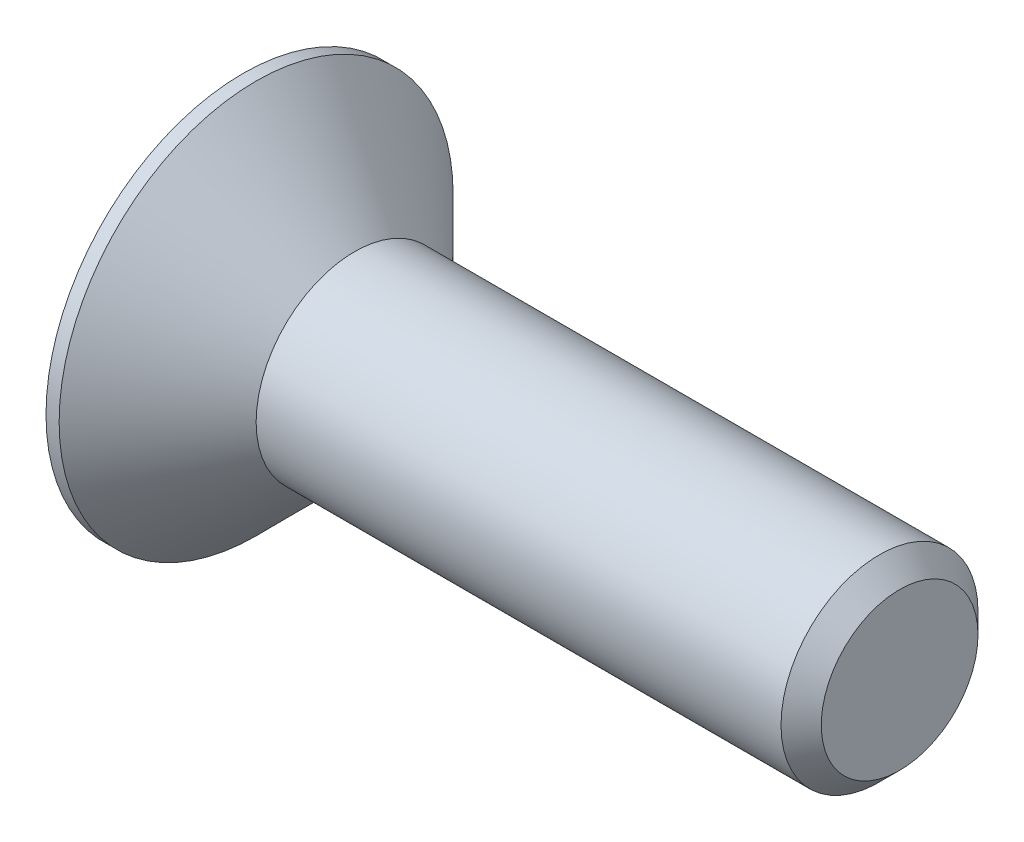
ISO-10303-21;
HEADER;
FILE_DESCRIPTION(('STEP AP214'),'2;1');
FILE_NAME('part.step','',(''),(''),'','','');
FILE_SCHEMA(('AUTOMOTIVE_DESIGN { 1 0 10303 214 1 1 1 1 }'));
ENDSEC;
DATA;
#1=APPLICATION_CONTEXT('core data for automotive mechanical design processes');
#2=APPLICATION_PROTOCOL_DEFINITION('international standard','automotive_design',2000,#1);
#3=PRODUCT_CONTEXT('',#1,'mechanical');
#4=PRODUCT('Part','Part','',(#3));
#5=PRODUCT_RELATED_PRODUCT_CATEGORY('part','',(#4));
#6=PRODUCT_DEFINITION_FORMATION('','',#4);
#7=PRODUCT_DEFINITION_CONTEXT('part definition',#1,'design');
#8=PRODUCT_DEFINITION('design','',#6,#7);
#9=PRODUCT_DEFINITION_SHAPE('','',#8);
#10=(LENGTH_UNIT() NAMED_UNIT(*) SI_UNIT(.MILLI.,.METRE.));
#11=(NAMED_UNIT(*) PLANE_ANGLE_UNIT() SI_UNIT($,.RADIAN.));
#12=(NAMED_UNIT(*) SI_UNIT($,.STERADIAN.) SOLID_ANGLE_UNIT());
#13=UNCERTAINTY_MEASURE_WITH_UNIT(LENGTH_MEASURE(1.E-05),#10,'distance_accuracy_value','');
#14=(GEOMETRIC_REPRESENTATION_CONTEXT(3) GLOBAL_UNCERTAINTY_ASSIGNED_CONTEXT((#13)) GLOBAL_UNIT_ASSIGNED_CONTEXT((#10,
#11,#12)) REPRESENTATION_CONTEXT('',''));
#15=CARTESIAN_POINT('',(0.,0.,0.));
#16=DIRECTION('',(0.,0.,1.));
#17=DIRECTION('',(1.,0.,0.));
#18=AXIS2_PLACEMENT_3D('',#15,#16,#17);
#19=CARTESIAN_POINT('',(-1.7,0.,0.));
#20=DIRECTION('',(1.,0.,0.));
#21=DIRECTION('',(0.,0.,-1.));
#22=AXIS2_PLACEMENT_3D('',#19,#20,#21);
#23=PLANE('',#22);
#24=CARTESIAN_POINT('',(-1.7,0.,0.));
#25=DIRECTION('',(1.,0.,0.));
#26=DIRECTION('',(0.,0.,-1.));
#27=AXIS2_PLACEMENT_3D('',#24,#25,#26);
#28=CIRCLE('',#27,3.);
#29=CARTESIAN_POINT('',(-1.7,0.,-3.));
#30=VERTEX_POINT('',#29);
#31=EDGE_CURVE('E11',#30,#30,#28,.T.);
#32=ORIENTED_EDGE('',*,*,#31,.F.);
#33=EDGE_LOOP('',(#32));
#34=FACE_BOUND('',#33,.T.);
#35=DIRECTION('',(0.,0.5,-0.866025403784439));
#36=VECTOR('',#35,1.);
#37=CARTESIAN_POINT('',(-1.7,-1.15470053837925,0.));
#38=LINE('',#37,#36);
#39=CARTESIAN_POINT('',(-1.7,-1.15470053837925,0.));
#40=VERTEX_POINT('',#39);
#41=CARTESIAN_POINT('',(-1.7,-0.577350269189626,-1.));
#42=VERTEX_POINT('',#41);
#43=EDGE_CURVE('E149',#40,#42,#38,.T.);
#44=ORIENTED_EDGE('',*,*,#43,.T.);
#45=DIRECTION('',(0.,1.,0.));
#46=VECTOR('',#45,1.);
#47=CARTESIAN_POINT('',(-1.7,-0.577350269189626,-1.));
#48=LINE('',#47,#46);
#49=CARTESIAN_POINT('',(-1.7,0.577350269189626,-1.));
#50=VERTEX_POINT('',#49);
#51=EDGE_CURVE('E151',#42,#50,#48,.T.);
#52=ORIENTED_EDGE('',*,*,#51,.T.);
#53=DIRECTION('',(0.,0.5,0.866025403784439));
#54=VECTOR('',#53,1.);
#55=CARTESIAN_POINT('',(-1.7,0.577350269189626,-1.));
#56=LINE('',#55,#54);
#57=CARTESIAN_POINT('',(-1.7,1.15470053837925,0.));
#58=VERTEX_POINT('',#57);
#59=EDGE_CURVE('E154',#50,#58,#56,.T.);
#60=ORIENTED_EDGE('',*,*,#59,.T.);
#61=DIRECTION('',(0.,-0.5,0.866025403784439));
#62=VECTOR('',#61,1.);
#63=CARTESIAN_POINT('',(-1.7,1.15470053837925,0.));
#64=LINE('',#63,#62);
#65=CARTESIAN_POINT('',(-1.7,0.577350269189626,1.));
#66=VERTEX_POINT('',#65);
#67=EDGE_CURVE('E99',#58,#66,#64,.T.);
#68=ORIENTED_EDGE('',*,*,#67,.T.);
#69=DIRECTION('',(0.,-1.,0.));
#70=VECTOR('',#69,1.);
#71=CARTESIAN_POINT('',(-1.7,0.577350269189626,1.));
#72=LINE('',#71,#70);
#73=CARTESIAN_POINT('',(-1.7,-0.577350269189626,1.));
#74=VERTEX_POINT('',#73);
#75=EDGE_CURVE('E156',#66,#74,#72,.T.);
#76=ORIENTED_EDGE('',*,*,#75,.T.);
#77=DIRECTION('',(0.,-0.5,-0.866025403784439));
#78=VECTOR('',#77,1.);
#79=CARTESIAN_POINT('',(-1.7,-0.577350269189626,1.));
#80=LINE('',#79,#78);
#81=EDGE_CURVE('E114',#74,#40,#80,.T.);
#82=ORIENTED_EDGE('',*,*,#81,.T.);
#83=EDGE_LOOP('',(#44,#52,#60,#68,#76,#82));
#84=FACE_BOUND('',#83,.T.);
#85=ADVANCED_FACE('F16',(#34,#84),#23,.F.);
#86=CARTESIAN_POINT('',(8.3,0.,0.));
#87=DIRECTION('',(1.,0.,0.));
#88=DIRECTION('',(0.,0.,-1.));
#89=AXIS2_PLACEMENT_3D('',#86,#87,#88);
#90=CYLINDRICAL_SURFACE('',#89,3.);
#91=CARTESIAN_POINT('',(-1.5,0.,0.));
#92=DIRECTION('',(1.,0.,0.));
#93=DIRECTION('',(0.,0.,-1.));
#94=AXIS2_PLACEMENT_3D('',#91,#92,#93);
#95=CIRCLE('',#94,3.);
#96=CARTESIAN_POINT('',(-1.5,0.,-3.));
#97=VERTEX_POINT('',#96);
#98=EDGE_CURVE('E23',#97,#97,#95,.T.);
#99=ORIENTED_EDGE('',*,*,#98,.F.);
#100=EDGE_LOOP('',(#99));
#101=FACE_BOUND('',#100,.T.);
#102=ORIENTED_EDGE('',*,*,#31,.T.);
#103=EDGE_LOOP('',(#102));
#104=FACE_BOUND('',#103,.T.);
#105=ADVANCED_FACE('F140',(#101,#104),#90,.T.);
#106=CARTESIAN_POINT('',(-1.5,0.,0.));
#107=DIRECTION('',(-1.,0.,0.));
#108=DIRECTION('',(0.,0.,1.));
#109=AXIS2_PLACEMENT_3D('',#106,#107,#108);
#110=CONICAL_SURFACE('',#109,3.,0.785398163397449);
#111=CARTESIAN_POINT('',(0.,0.,0.));
#112=DIRECTION('',(1.,0.,0.));
#113=DIRECTION('',(0.,0.,-1.));
#114=AXIS2_PLACEMENT_3D('',#111,#112,#113);
#115=CIRCLE('',#114,1.5);
#116=CARTESIAN_POINT('',(0.,0.,-1.5));
#117=VERTEX_POINT('',#116);
#118=EDGE_CURVE('E133',#117,#117,#115,.T.);
#119=ORIENTED_EDGE('',*,*,#118,.F.);
#120=EDGE_LOOP('',(#119));
#121=FACE_BOUND('',#120,.T.);
#122=ORIENTED_EDGE('',*,*,#98,.T.);
#123=EDGE_LOOP('',(#122));
#124=FACE_BOUND('',#123,.T.);
#125=ADVANCED_FACE('F138',(#121,#124),#110,.T.);
#126=CARTESIAN_POINT('',(8.3,0.,0.));
#127=DIRECTION('',(1.,0.,0.));
#128=DIRECTION('',(0.,0.,-1.));
#129=AXIS2_PLACEMENT_3D('',#126,#127,#128);
#130=CYLINDRICAL_SURFACE('',#129,1.5);
#131=CARTESIAN_POINT('',(7.9935,0.,0.));
#132=DIRECTION('',(1.,0.,0.));
#133=DIRECTION('',(0.,0.,-1.));
#134=AXIS2_PLACEMENT_3D('',#131,#132,#133);
#135=CIRCLE('',#134,1.5);
#136=CARTESIAN_POINT('',(7.9935,0.,-1.5));
#137=VERTEX_POINT('',#136);
#138=EDGE_CURVE('E130',#137,#137,#135,.T.);
#139=ORIENTED_EDGE('',*,*,#138,.F.);
#140=EDGE_LOOP('',(#139));
#141=FACE_BOUND('',#140,.T.);
#142=ORIENTED_EDGE('',*,*,#118,.T.);
#143=EDGE_LOOP('',(#142));
#144=FACE_BOUND('',#143,.T.);
#145=ADVANCED_FACE('F243',(#141,#144),#130,.T.);
#146=CARTESIAN_POINT('',(7.9935,0.,0.));
#147=DIRECTION('',(-1.,0.,0.));
#148=DIRECTION('',(0.,0.,1.));
#149=AXIS2_PLACEMENT_3D('',#146,#147,#148);
#150=CONICAL_SURFACE('',#149,1.5,0.785398163397449);
#151=CARTESIAN_POINT('',(8.3,0.,0.));
#152=DIRECTION('',(1.,0.,0.));
#153=DIRECTION('',(0.,0.,-1.));
#154=AXIS2_PLACEMENT_3D('',#151,#152,#153);
#155=CIRCLE('',#154,1.1935);
#156=CARTESIAN_POINT('',(8.3,0.,-1.1935));
#157=VERTEX_POINT('',#156);
#158=EDGE_CURVE('E126',#157,#157,#155,.T.);
#159=ORIENTED_EDGE('',*,*,#158,.F.);
#160=EDGE_LOOP('',(#159));
#161=FACE_BOUND('',#160,.T.);
#162=ORIENTED_EDGE('',*,*,#138,.T.);
#163=EDGE_LOOP('',(#162));
#164=FACE_BOUND('',#163,.T.);
#165=ADVANCED_FACE('F239',(#161,#164),#150,.T.);
#166=CARTESIAN_POINT('',(8.3,1.1935,0.));
#167=DIRECTION('',(-1.,0.,0.));
#168=DIRECTION('',(0.,0.,1.));
#169=AXIS2_PLACEMENT_3D('',#166,#167,#168);
#170=PLANE('',#169);
#171=ORIENTED_EDGE('',*,*,#158,.T.);
#172=EDGE_LOOP('',(#171));
#173=FACE_BOUND('',#172,.T.);
#174=ADVANCED_FACE('F234',(#173),#170,.F.);
#175=CARTESIAN_POINT('',(-0.85,0.577350269189626,1.));
#176=DIRECTION('',(0.,0.,-1.));
#177=DIRECTION('',(-1.,0.,0.));
#178=AXIS2_PLACEMENT_3D('',#175,#176,#177);
#179=PLANE('',#178);
#180=ORIENTED_EDGE('',*,*,#75,.F.);
#181=DIRECTION('',(-1.,0.,0.));
#182=VECTOR('',#181,1.);
#183=CARTESIAN_POINT('',(-0.85,0.577350269189626,1.));
#184=LINE('',#183,#182);
#185=CARTESIAN_POINT('',(-0.85,0.577350269189626,1.));
#186=VERTEX_POINT('',#185);
#187=EDGE_CURVE('E163',#186,#66,#184,.T.);
#188=ORIENTED_EDGE('',*,*,#187,.F.);
#189=DIRECTION('',(0.,-1.,0.));
#190=VECTOR('',#189,1.);
#191=CARTESIAN_POINT('',(-0.85,0.577350269189626,1.));
#192=LINE('',#191,#190);
#193=CARTESIAN_POINT('',(-0.85,0.,1.));
#194=VERTEX_POINT('',#193);
#195=EDGE_CURVE('E96',#186,#194,#192,.T.);
#196=ORIENTED_EDGE('',*,*,#195,.T.);
#197=CARTESIAN_POINT('',(-0.85,-0.577350269189626,1.));
#198=VERTEX_POINT('',#197);
#199=EDGE_CURVE('E88',#194,#198,#192,.T.);
#200=ORIENTED_EDGE('',*,*,#199,.T.);
#201=DIRECTION('',(-1.,0.,0.));
#202=VECTOR('',#201,1.);
#203=CARTESIAN_POINT('',(-0.85,-0.577350269189626,1.));
#204=LINE('',#203,#202);
#205=EDGE_CURVE('E92',#198,#74,#204,.T.);
#206=ORIENTED_EDGE('',*,*,#205,.T.);
#207=EDGE_LOOP('',(#180,#188,#196,#200,#206));
#208=FACE_BOUND('',#207,.T.);
#209=ADVANCED_FACE('F90',(#208),#179,.T.);
#210=CARTESIAN_POINT('',(-0.85,-0.577350269189626,1.));
#211=DIRECTION('',(0.,0.866025403784439,-0.5));
#212=DIRECTION('',(0.,0.5,0.866025403784439));
#213=AXIS2_PLACEMENT_3D('',#210,#211,#212);
#214=PLANE('',#213);
#215=ORIENTED_EDGE('',*,*,#81,.F.);
#216=ORIENTED_EDGE('',*,*,#205,.F.);
#217=DIRECTION('',(0.,-0.5,-0.866025403784439));
#218=VECTOR('',#217,1.);
#219=CARTESIAN_POINT('',(-0.85,-0.577350269189626,1.));
#220=LINE('',#219,#218);
#221=CARTESIAN_POINT('',(-0.85,-0.866025403784439,0.5));
#222=VERTEX_POINT('',#221);
#223=EDGE_CURVE('E102',#198,#222,#220,.T.);
#224=ORIENTED_EDGE('',*,*,#223,.T.);
#225=CARTESIAN_POINT('',(-0.85,-1.15470053837925,0.));
#226=VERTEX_POINT('',#225);
#227=EDGE_CURVE('E109',#222,#226,#220,.T.);
#228=ORIENTED_EDGE('',*,*,#227,.T.);
#229=DIRECTION('',(-1.,0.,0.));
#230=VECTOR('',#229,1.);
#231=CARTESIAN_POINT('',(-0.85,-1.15470053837925,0.));
#232=LINE('',#231,#230);
#233=EDGE_CURVE('E116',#226,#40,#232,.T.);
#234=ORIENTED_EDGE('',*,*,#233,.T.);
#235=EDGE_LOOP('',(#215,#216,#224,#228,#234));
#236=FACE_BOUND('',#235,.T.);
#237=ADVANCED_FACE('F111',(#236),#214,.T.);
#238=CARTESIAN_POINT('',(-0.85,-1.15470053837925,0.));
#239=DIRECTION('',(0.,0.866025403784439,0.5));
#240=DIRECTION('',(0.,-0.5,0.866025403784439));
#241=AXIS2_PLACEMENT_3D('',#238,#239,#240);
#242=PLANE('',#241);
#243=ORIENTED_EDGE('',*,*,#43,.F.);
#244=ORIENTED_EDGE('',*,*,#233,.F.);
#245=DIRECTION('',(0.,0.5,-0.866025403784439));
#246=VECTOR('',#245,1.);
#247=CARTESIAN_POINT('',(-0.85,-1.15470053837925,0.));
#248=LINE('',#247,#246);
#249=CARTESIAN_POINT('',(-0.85,-0.866025403784439,-0.5));
#250=VERTEX_POINT('',#249);
#251=EDGE_CURVE('E30',#226,#250,#248,.T.);
#252=ORIENTED_EDGE('',*,*,#251,.T.);
#253=CARTESIAN_POINT('',(-0.85,-0.577350269189626,-1.));
#254=VERTEX_POINT('',#253);
#255=EDGE_CURVE('E108',#250,#254,#248,.T.);
#256=ORIENTED_EDGE('',*,*,#255,.T.);
#257=DIRECTION('',(-1.,0.,0.));
#258=VECTOR('',#257,1.);
#259=CARTESIAN_POINT('',(-0.85,-0.577350269189626,-1.));
#260=LINE('',#259,#258);
#261=EDGE_CURVE('E122',#254,#42,#260,.T.);
#262=ORIENTED_EDGE('',*,*,#261,.T.);
#263=EDGE_LOOP('',(#243,#244,#252,#256,#262));
#264=FACE_BOUND('',#263,.T.);
#265=ADVANCED_FACE('F173',(#264),#242,.T.);
#266=CARTESIAN_POINT('',(-0.85,-0.577350269189626,-1.));
#267=DIRECTION('',(0.,0.,1.));
#268=DIRECTION('',(1.,0.,0.));
#269=AXIS2_PLACEMENT_3D('',#266,#267,#268);
#270=PLANE('',#269);
#271=ORIENTED_EDGE('',*,*,#51,.F.);
#272=ORIENTED_EDGE('',*,*,#261,.F.);
#273=DIRECTION('',(0.,1.,0.));
#274=VECTOR('',#273,1.);
#275=CARTESIAN_POINT('',(-0.85,-0.577350269189626,-1.));
#276=LINE('',#275,#274);
#277=CARTESIAN_POINT('',(-0.85,0.,-1.));
#278=VERTEX_POINT('',#277);
#279=EDGE_CURVE('E178',#254,#278,#276,.T.);
#280=ORIENTED_EDGE('',*,*,#279,.T.);
#281=CARTESIAN_POINT('',(-0.85,0.577350269189626,-1.));
#282=VERTEX_POINT('',#281);
#283=EDGE_CURVE('E186',#278,#282,#276,.T.);
#284=ORIENTED_EDGE('',*,*,#283,.T.);
#285=DIRECTION('',(-1.,0.,0.));
#286=VECTOR('',#285,1.);
#287=CARTESIAN_POINT('',(-0.85,0.577350269189626,-1.));
#288=LINE('',#287,#286);
#289=EDGE_CURVE('E170',#282,#50,#288,.T.);
#290=ORIENTED_EDGE('',*,*,#289,.T.);
#291=EDGE_LOOP('',(#271,#272,#280,#284,#290));
#292=FACE_BOUND('',#291,.T.);
#293=ADVANCED_FACE('F177',(#292),#270,.T.);
#294=CARTESIAN_POINT('',(-0.85,0.577350269189626,-1.));
#295=DIRECTION('',(0.,-0.866025403784439,0.5));
#296=DIRECTION('',(0.,-0.5,-0.866025403784439));
#297=AXIS2_PLACEMENT_3D('',#294,#295,#296);
#298=PLANE('',#297);
#299=ORIENTED_EDGE('',*,*,#59,.F.);
#300=ORIENTED_EDGE('',*,*,#289,.F.);
#301=DIRECTION('',(0.,0.5,0.866025403784439));
#302=VECTOR('',#301,1.);
#303=CARTESIAN_POINT('',(-0.85,0.577350269189626,-1.));
#304=LINE('',#303,#302);
#305=CARTESIAN_POINT('',(-0.85,0.866025403784439,-0.5));
#306=VERTEX_POINT('',#305);
#307=EDGE_CURVE('E188',#282,#306,#304,.T.);
#308=ORIENTED_EDGE('',*,*,#307,.T.);
#309=CARTESIAN_POINT('',(-0.85,1.15470053837925,0.));
#310=VERTEX_POINT('',#309);
#311=EDGE_CURVE('E185',#306,#310,#304,.T.);
#312=ORIENTED_EDGE('',*,*,#311,.T.);
#313=DIRECTION('',(-1.,0.,0.));
#314=VECTOR('',#313,1.);
#315=CARTESIAN_POINT('',(-0.85,1.15470053837925,0.));
#316=LINE('',#315,#314);
#317=EDGE_CURVE('E166',#310,#58,#316,.T.);
#318=ORIENTED_EDGE('',*,*,#317,.T.);
#319=EDGE_LOOP('',(#299,#300,#308,#312,#318));
#320=FACE_BOUND('',#319,.T.);
#321=ADVANCED_FACE('F216',(#320),#298,.T.);
#322=CARTESIAN_POINT('',(-0.85,1.15470053837925,0.));
#323=DIRECTION('',(0.,-0.866025403784439,-0.5));
#324=DIRECTION('',(0.,0.5,-0.866025403784439));
#325=AXIS2_PLACEMENT_3D('',#322,#323,#324);
#326=PLANE('',#325);
#327=ORIENTED_EDGE('',*,*,#67,.F.);
#328=ORIENTED_EDGE('',*,*,#317,.F.);
#329=DIRECTION('',(0.,-0.5,0.866025403784439));
#330=VECTOR('',#329,1.);
#331=CARTESIAN_POINT('',(-0.85,1.15470053837925,0.));
#332=LINE('',#331,#330);
#333=CARTESIAN_POINT('',(-0.85,0.866025403784439,0.5));
#334=VERTEX_POINT('',#333);
#335=EDGE_CURVE('E167',#310,#334,#332,.T.);
#336=ORIENTED_EDGE('',*,*,#335,.T.);
#337=EDGE_CURVE('E193',#334,#186,#332,.T.);
#338=ORIENTED_EDGE('',*,*,#337,.T.);
#339=ORIENTED_EDGE('',*,*,#187,.T.);
#340=EDGE_LOOP('',(#327,#328,#336,#338,#339));
#341=FACE_BOUND('',#340,.T.);
#342=ADVANCED_FACE('F196',(#341),#326,.T.);
#343=CARTESIAN_POINT('',(-0.85,0.,0.));
#344=DIRECTION('',(1.,0.,0.));
#345=DIRECTION('',(0.,0.,-1.));
#346=AXIS2_PLACEMENT_3D('',#343,#344,#345);
#347=PLANE('',#346);
#348=CARTESIAN_POINT('',(-0.85,0.,0.));
#349=DIRECTION('',(1.,0.,0.));
#350=DIRECTION('',(0.,0.,-1.));
#351=AXIS2_PLACEMENT_3D('',#348,#349,#350);
#352=CIRCLE('',#351,1.);
#353=EDGE_CURVE('E115',#278,#306,#352,.T.);
#354=ORIENTED_EDGE('',*,*,#353,.T.);
#355=ORIENTED_EDGE('',*,*,#307,.F.);
#356=ORIENTED_EDGE('',*,*,#283,.F.);
#357=EDGE_LOOP('',(#354,#355,#356));
#358=FACE_BOUND('',#357,.T.);
#359=ADVANCED_FACE('F211',(#358),#347,.F.);
#360=ORIENTED_EDGE('',*,*,#311,.F.);
#361=EDGE_CURVE('E121',#306,#334,#352,.T.);
#362=ORIENTED_EDGE('',*,*,#361,.T.);
#363=ORIENTED_EDGE('',*,*,#335,.F.);
#364=EDGE_LOOP('',(#360,#362,#363));
#365=FACE_BOUND('',#364,.T.);
#366=ADVANCED_FACE('F213',(#365),#347,.F.);
#367=EDGE_CURVE('E127',#334,#194,#352,.T.);
#368=ORIENTED_EDGE('',*,*,#367,.T.);
#369=ORIENTED_EDGE('',*,*,#195,.F.);
#370=ORIENTED_EDGE('',*,*,#337,.F.);
#371=EDGE_LOOP('',(#368,#369,#370));
#372=FACE_BOUND('',#371,.T.);
#373=ADVANCED_FACE('F202',(#372),#347,.F.);
#374=EDGE_CURVE('E104',#194,#222,#352,.T.);
#375=ORIENTED_EDGE('',*,*,#374,.T.);
#376=ORIENTED_EDGE('',*,*,#223,.F.);
#377=ORIENTED_EDGE('',*,*,#199,.F.);
#378=EDGE_LOOP('',(#375,#376,#377));
#379=FACE_BOUND('',#378,.T.);
#380=ADVANCED_FACE('F103',(#379),#347,.F.);
#381=EDGE_CURVE('E205',#222,#250,#352,.T.);
#382=ORIENTED_EDGE('',*,*,#381,.T.);
#383=ORIENTED_EDGE('',*,*,#251,.F.);
#384=ORIENTED_EDGE('',*,*,#227,.F.);
#385=EDGE_LOOP('',(#382,#383,#384));
#386=FACE_BOUND('',#385,.T.);
#387=ADVANCED_FACE('F204',(#386),#347,.F.);
#388=EDGE_CURVE('E119',#250,#278,#352,.T.);
#389=ORIENTED_EDGE('',*,*,#388,.T.);
#390=ORIENTED_EDGE('',*,*,#279,.F.);
#391=ORIENTED_EDGE('',*,*,#255,.F.);
#392=EDGE_LOOP('',(#389,#390,#391));
#393=FACE_BOUND('',#392,.T.);
#394=ADVANCED_FACE('F181',(#393),#347,.F.);
#395=CARTESIAN_POINT('',(-0.85,0.,0.));
#396=DIRECTION('',(-1.,0.,0.));
#397=DIRECTION('',(0.,0.,1.));
#398=AXIS2_PLACEMENT_3D('',#395,#396,#397);
#399=CONICAL_SURFACE('',#398,1.,1.30899693899575);
#400=CARTESIAN_POINT('',(-0.582050807568878,0.,0.));
#401=VERTEX_POINT('',#400);
#402=VERTEX_LOOP('',#401);
#403=FACE_BOUND('',#402,.T.);
#404=ORIENTED_EDGE('',*,*,#361,.F.);
#405=ORIENTED_EDGE('',*,*,#353,.F.);
#406=ORIENTED_EDGE('',*,*,#388,.F.);
#407=ORIENTED_EDGE('',*,*,#381,.F.);
#408=ORIENTED_EDGE('',*,*,#374,.F.);
#409=ORIENTED_EDGE('',*,*,#367,.F.);
#410=EDGE_LOOP('',(#404,#405,#406,#407,#408,#409));
#411=FACE_BOUND('',#410,.T.);
#412=ADVANCED_FACE('F207',(#403,#411),#399,.F.);
#413=CLOSED_SHELL('',(#85,#105,#125,#145,#165,#174,#209,#237,#265,#293,#321,#342,#359,#366,#373,
#380,#387,#394,#412));
#414=MANIFOLD_SOLID_BREP('B1',#413);
#415=ADVANCED_BREP_SHAPE_REPRESENTATION('',(#18,#414),#14);
#416=SHAPE_DEFINITION_REPRESENTATION(#9,#415);
ENDSEC;
END-ISO-10303-21;
